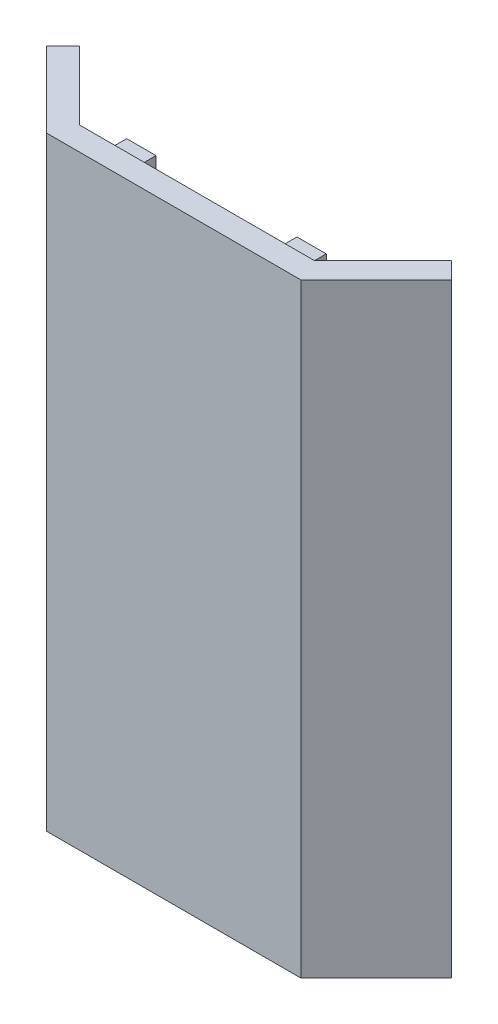
ISO-10303-21;
HEADER;
FILE_DESCRIPTION(('STEP AP214'),'2;1');
FILE_NAME('part.step','',(''),(''),'','','');
FILE_SCHEMA(('AUTOMOTIVE_DESIGN { 1 0 10303 214 1 1 1 1 }'));
ENDSEC;
DATA;
#1=APPLICATION_CONTEXT('core data for automotive mechanical design processes');
#2=APPLICATION_PROTOCOL_DEFINITION('international standard','automotive_design',2000,#1);
#3=PRODUCT_CONTEXT('',#1,'mechanical');
#4=PRODUCT('Part','Part','',(#3));
#5=PRODUCT_RELATED_PRODUCT_CATEGORY('part','',(#4));
#6=PRODUCT_DEFINITION_FORMATION('','',#4);
#7=PRODUCT_DEFINITION_CONTEXT('part definition',#1,'design');
#8=PRODUCT_DEFINITION('design','',#6,#7);
#9=PRODUCT_DEFINITION_SHAPE('','',#8);
#10=(LENGTH_UNIT() NAMED_UNIT(*) SI_UNIT(.MILLI.,.METRE.));
#11=(NAMED_UNIT(*) PLANE_ANGLE_UNIT() SI_UNIT($,.RADIAN.));
#12=(NAMED_UNIT(*) SI_UNIT($,.STERADIAN.) SOLID_ANGLE_UNIT());
#13=UNCERTAINTY_MEASURE_WITH_UNIT(LENGTH_MEASURE(1.E-05),#10,'distance_accuracy_value','');
#14=(GEOMETRIC_REPRESENTATION_CONTEXT(3) GLOBAL_UNCERTAINTY_ASSIGNED_CONTEXT((#13)) GLOBAL_UNIT_ASSIGNED_CONTEXT((#10,
#11,#12)) REPRESENTATION_CONTEXT('',''));
#15=CARTESIAN_POINT('',(0.,0.,0.));
#16=DIRECTION('',(0.,0.,1.));
#17=DIRECTION('',(1.,0.,0.));
#18=AXIS2_PLACEMENT_3D('',#15,#16,#17);
#19=CARTESIAN_POINT('',(-40.,103.,0.));
#20=DIRECTION('',(0.,0.,-1.));
#21=DIRECTION('',(-1.,0.,0.));
#22=AXIS2_PLACEMENT_3D('',#19,#20,#21);
#23=PLANE('',#22);
#24=DIRECTION('',(-1.,0.,0.));
#25=VECTOR('',#24,1.);
#26=CARTESIAN_POINT('',(-34.,97.,0.));
#27=LINE('',#26,#25);
#28=CARTESIAN_POINT('',(-24.,97.,0.));
#29=VERTEX_POINT('',#28);
#30=CARTESIAN_POINT('',(-34.,97.,0.));
#31=VERTEX_POINT('',#30);
#32=EDGE_CURVE('E204',#29,#31,#27,.T.);
#33=ORIENTED_EDGE('',*,*,#32,.T.);
#34=DIRECTION('',(0.,-1.,0.));
#35=VECTOR('',#34,1.);
#36=CARTESIAN_POINT('',(-34.,97.,0.));
#37=LINE('',#36,#35);
#38=CARTESIAN_POINT('',(-34.,91.,0.));
#39=VERTEX_POINT('',#38);
#40=EDGE_CURVE('E218',#31,#39,#37,.T.);
#41=ORIENTED_EDGE('',*,*,#40,.T.);
#42=DIRECTION('',(1.,0.,0.));
#43=VECTOR('',#42,1.);
#44=CARTESIAN_POINT('',(-34.,91.,0.));
#45=LINE('',#44,#43);
#46=CARTESIAN_POINT('',(-24.,91.,0.));
#47=VERTEX_POINT('',#46);
#48=EDGE_CURVE('E59',#39,#47,#45,.T.);
#49=ORIENTED_EDGE('',*,*,#48,.T.);
#50=DIRECTION('',(0.,1.,0.));
#51=VECTOR('',#50,1.);
#52=CARTESIAN_POINT('',(-24.,97.,0.));
#53=LINE('',#52,#51);
#54=EDGE_CURVE('E54',#47,#29,#53,.T.);
#55=ORIENTED_EDGE('',*,*,#54,.T.);
#56=EDGE_LOOP('',(#33,#41,#49,#55));
#57=FACE_BOUND('',#56,.T.);
#58=DIRECTION('',(0.,1.,0.));
#59=VECTOR('',#58,1.);
#60=CARTESIAN_POINT('',(34.,97.,0.));
#61=LINE('',#60,#59);
#62=CARTESIAN_POINT('',(34.,91.,0.));
#63=VERTEX_POINT('',#62);
#64=CARTESIAN_POINT('',(34.,97.,0.));
#65=VERTEX_POINT('',#64);
#66=EDGE_CURVE('E207',#63,#65,#61,.T.);
#67=ORIENTED_EDGE('',*,*,#66,.T.);
#68=DIRECTION('',(-1.,0.,0.));
#69=VECTOR('',#68,1.);
#70=CARTESIAN_POINT('',(34.,97.,0.));
#71=LINE('',#70,#69);
#72=CARTESIAN_POINT('',(24.,97.,0.));
#73=VERTEX_POINT('',#72);
#74=EDGE_CURVE('E240',#65,#73,#71,.T.);
#75=ORIENTED_EDGE('',*,*,#74,.T.);
#76=DIRECTION('',(0.,-1.,0.));
#77=VECTOR('',#76,1.);
#78=CARTESIAN_POINT('',(24.,97.,0.));
#79=LINE('',#78,#77);
#80=CARTESIAN_POINT('',(24.,91.,0.));
#81=VERTEX_POINT('',#80);
#82=EDGE_CURVE('E253',#73,#81,#79,.T.);
#83=ORIENTED_EDGE('',*,*,#82,.T.);
#84=DIRECTION('',(1.,0.,0.));
#85=VECTOR('',#84,1.);
#86=CARTESIAN_POINT('',(34.,91.,0.));
#87=LINE('',#86,#85);
#88=EDGE_CURVE('E251',#81,#63,#87,.T.);
#89=ORIENTED_EDGE('',*,*,#88,.T.);
#90=EDGE_LOOP('',(#67,#75,#83,#89));
#91=FACE_BOUND('',#90,.T.);
#92=DIRECTION('',(1.,0.,0.));
#93=VECTOR('',#92,1.);
#94=CARTESIAN_POINT('',(-40.,-103.,0.));
#95=LINE('',#94,#93);
#96=CARTESIAN_POINT('',(-40.,-103.,0.));
#97=VERTEX_POINT('',#96);
#98=CARTESIAN_POINT('',(40.,-103.,0.));
#99=VERTEX_POINT('',#98);
#100=EDGE_CURVE('E356',#97,#99,#95,.T.);
#101=ORIENTED_EDGE('',*,*,#100,.F.);
#102=DIRECTION('',(0.,-1.,0.));
#103=VECTOR('',#102,1.);
#104=CARTESIAN_POINT('',(-40.,103.,0.));
#105=LINE('',#104,#103);
#106=CARTESIAN_POINT('',(-40.,103.,0.));
#107=VERTEX_POINT('',#106);
#108=EDGE_CURVE('E377',#107,#97,#105,.T.);
#109=ORIENTED_EDGE('',*,*,#108,.F.);
#110=DIRECTION('',(1.,0.,0.));
#111=VECTOR('',#110,1.);
#112=CARTESIAN_POINT('',(-40.,103.,0.));
#113=LINE('',#112,#111);
#114=CARTESIAN_POINT('',(40.,103.,0.));
#115=VERTEX_POINT('',#114);
#116=EDGE_CURVE('E335',#107,#115,#113,.T.);
#117=ORIENTED_EDGE('',*,*,#116,.T.);
#118=DIRECTION('',(0.,-1.,0.));
#119=VECTOR('',#118,1.);
#120=CARTESIAN_POINT('',(40.,103.,0.));
#121=LINE('',#120,#119);
#122=EDGE_CURVE('E375',#115,#99,#121,.T.);
#123=ORIENTED_EDGE('',*,*,#122,.T.);
#124=EDGE_LOOP('',(#101,#109,#117,#123));
#125=FACE_BOUND('',#124,.T.);
#126=DIRECTION('',(-1.,0.,0.));
#127=VECTOR('',#126,1.);
#128=CARTESIAN_POINT('',(34.,-97.,0.));
#129=LINE('',#128,#127);
#130=CARTESIAN_POINT('',(34.,-97.,0.));
#131=VERTEX_POINT('',#130);
#132=CARTESIAN_POINT('',(24.,-97.,0.));
#133=VERTEX_POINT('',#132);
#134=EDGE_CURVE('E310',#131,#133,#129,.T.);
#135=ORIENTED_EDGE('',*,*,#134,.F.);
#136=DIRECTION('',(0.,-1.,0.));
#137=VECTOR('',#136,1.);
#138=CARTESIAN_POINT('',(34.,-97.,0.));
#139=LINE('',#138,#137);
#140=CARTESIAN_POINT('',(34.,-91.,0.));
#141=VERTEX_POINT('',#140);
#142=EDGE_CURVE('E296',#141,#131,#139,.T.);
#143=ORIENTED_EDGE('',*,*,#142,.F.);
#144=DIRECTION('',(1.,0.,0.));
#145=VECTOR('',#144,1.);
#146=CARTESIAN_POINT('',(34.,-91.,0.));
#147=LINE('',#146,#145);
#148=CARTESIAN_POINT('',(24.,-91.,0.));
#149=VERTEX_POINT('',#148);
#150=EDGE_CURVE('E301',#149,#141,#147,.T.);
#151=ORIENTED_EDGE('',*,*,#150,.F.);
#152=DIRECTION('',(0.,1.,0.));
#153=VECTOR('',#152,1.);
#154=CARTESIAN_POINT('',(24.,-97.,0.));
#155=LINE('',#154,#153);
#156=EDGE_CURVE('E312',#133,#149,#155,.T.);
#157=ORIENTED_EDGE('',*,*,#156,.F.);
#158=EDGE_LOOP('',(#135,#143,#151,#157));
#159=FACE_BOUND('',#158,.T.);
#160=DIRECTION('',(0.,1.,0.));
#161=VECTOR('',#160,1.);
#162=CARTESIAN_POINT('',(-34.,-97.,0.));
#163=LINE('',#162,#161);
#164=CARTESIAN_POINT('',(-34.,-97.,0.));
#165=VERTEX_POINT('',#164);
#166=CARTESIAN_POINT('',(-34.,-91.,0.));
#167=VERTEX_POINT('',#166);
#168=EDGE_CURVE('E281',#165,#167,#163,.T.);
#169=ORIENTED_EDGE('',*,*,#168,.F.);
#170=DIRECTION('',(-1.,0.,0.));
#171=VECTOR('',#170,1.);
#172=CARTESIAN_POINT('',(-34.,-97.,0.));
#173=LINE('',#172,#171);
#174=CARTESIAN_POINT('',(-24.,-97.,0.));
#175=VERTEX_POINT('',#174);
#176=EDGE_CURVE('E267',#175,#165,#173,.T.);
#177=ORIENTED_EDGE('',*,*,#176,.F.);
#178=DIRECTION('',(0.,-1.,0.));
#179=VECTOR('',#178,1.);
#180=CARTESIAN_POINT('',(-24.,-97.,0.));
#181=LINE('',#180,#179);
#182=CARTESIAN_POINT('',(-24.,-91.,0.));
#183=VERTEX_POINT('',#182);
#184=EDGE_CURVE('E272',#183,#175,#181,.T.);
#185=ORIENTED_EDGE('',*,*,#184,.F.);
#186=DIRECTION('',(1.,0.,0.));
#187=VECTOR('',#186,1.);
#188=CARTESIAN_POINT('',(-34.,-91.,0.));
#189=LINE('',#188,#187);
#190=EDGE_CURVE('E283',#167,#183,#189,.T.);
#191=ORIENTED_EDGE('',*,*,#190,.F.);
#192=EDGE_LOOP('',(#169,#177,#185,#191));
#193=FACE_BOUND('',#192,.T.);
#194=ADVANCED_FACE('F37',(#57,#91,#125,#159,#193),#23,.T.);
#195=CARTESIAN_POINT('',(-43.3137084989847,103.,8.));
#196=DIRECTION('',(-0.707106781186544,0.,0.707106781186551));
#197=DIRECTION('',(0.707106781186551,0.,0.707106781186544));
#198=AXIS2_PLACEMENT_3D('',#195,#196,#197);
#199=PLANE('',#198);
#200=DIRECTION('',(-0.707106781186551,0.,-0.707106781186544));
#201=VECTOR('',#200,1.);
#202=CARTESIAN_POINT('',(-43.3137084989847,-103.,8.));
#203=LINE('',#202,#201);
#204=CARTESIAN_POINT('',(-43.3137084989847,-103.,8.));
#205=VERTEX_POINT('',#204);
#206=CARTESIAN_POINT('',(-68.9913780286486,-103.,-17.6776695296635));
#207=VERTEX_POINT('',#206);
#208=EDGE_CURVE('E325',#205,#207,#203,.T.);
#209=ORIENTED_EDGE('',*,*,#208,.F.);
#210=DIRECTION('',(0.,-1.,0.));
#211=VECTOR('',#210,1.);
#212=CARTESIAN_POINT('',(-43.3137084989847,103.,8.));
#213=LINE('',#212,#211);
#214=CARTESIAN_POINT('',(-43.3137084989847,103.,8.));
#215=VERTEX_POINT('',#214);
#216=EDGE_CURVE('E11',#215,#205,#213,.T.);
#217=ORIENTED_EDGE('',*,*,#216,.F.);
#218=DIRECTION('',(-0.707106781186551,0.,-0.707106781186544));
#219=VECTOR('',#218,1.);
#220=CARTESIAN_POINT('',(-43.3137084989847,103.,8.));
#221=LINE('',#220,#219);
#222=CARTESIAN_POINT('',(-68.9913780286486,103.,-17.6776695296635));
#223=VERTEX_POINT('',#222);
#224=EDGE_CURVE('E326',#215,#223,#221,.T.);
#225=ORIENTED_EDGE('',*,*,#224,.T.);
#226=DIRECTION('',(0.,-1.,0.));
#227=VECTOR('',#226,1.);
#228=CARTESIAN_POINT('',(-68.9913780286486,103.,-17.6776695296635));
#229=LINE('',#228,#227);
#230=EDGE_CURVE('E41',#223,#207,#229,.T.);
#231=ORIENTED_EDGE('',*,*,#230,.T.);
#232=EDGE_LOOP('',(#209,#217,#225,#231));
#233=FACE_BOUND('',#232,.T.);
#234=ADVANCED_FACE('F39',(#233),#199,.T.);
#235=CARTESIAN_POINT('',(-43.3137084989847,103.,8.));
#236=DIRECTION('',(0.,0.,-1.));
#237=DIRECTION('',(-1.,0.,0.));
#238=AXIS2_PLACEMENT_3D('',#235,#236,#237);
#239=PLANE('',#238);
#240=DIRECTION('',(1.,0.,0.));
#241=VECTOR('',#240,1.);
#242=CARTESIAN_POINT('',(-43.3137084989847,-103.,8.));
#243=LINE('',#242,#241);
#244=CARTESIAN_POINT('',(43.3137084989848,-103.,8.));
#245=VERTEX_POINT('',#244);
#246=EDGE_CURVE('E330',#205,#245,#243,.T.);
#247=ORIENTED_EDGE('',*,*,#246,.T.);
#248=DIRECTION('',(0.,-1.,0.));
#249=VECTOR('',#248,1.);
#250=CARTESIAN_POINT('',(43.3137084989848,103.,8.));
#251=LINE('',#250,#249);
#252=CARTESIAN_POINT('',(43.3137084989848,103.,8.));
#253=VERTEX_POINT('',#252);
#254=EDGE_CURVE('E46',#253,#245,#251,.T.);
#255=ORIENTED_EDGE('',*,*,#254,.F.);
#256=DIRECTION('',(1.,0.,0.));
#257=VECTOR('',#256,1.);
#258=CARTESIAN_POINT('',(-43.3137084989847,103.,8.));
#259=LINE('',#258,#257);
#260=EDGE_CURVE('E346',#215,#253,#259,.T.);
#261=ORIENTED_EDGE('',*,*,#260,.F.);
#262=ORIENTED_EDGE('',*,*,#216,.T.);
#263=EDGE_LOOP('',(#247,#255,#261,#262));
#264=FACE_BOUND('',#263,.T.);
#265=ADVANCED_FACE('F394',(#264),#239,.F.);
#266=CARTESIAN_POINT('',(43.3137084989848,103.,8.));
#267=DIRECTION('',(-0.707106781186548,0.,-0.707106781186548));
#268=DIRECTION('',(-0.707106781186548,0.,0.707106781186548));
#269=AXIS2_PLACEMENT_3D('',#266,#267,#268);
#270=PLANE('',#269);
#271=DIRECTION('',(0.707106781186548,0.,-0.707106781186548));
#272=VECTOR('',#271,1.);
#273=CARTESIAN_POINT('',(43.3137084989848,-103.,8.));
#274=LINE('',#273,#272);
#275=CARTESIAN_POINT('',(68.9913780286485,-103.,-17.6776695296637));
#276=VERTEX_POINT('',#275);
#277=EDGE_CURVE('E365',#245,#276,#274,.T.);
#278=ORIENTED_EDGE('',*,*,#277,.T.);
#279=DIRECTION('',(0.,-1.,0.));
#280=VECTOR('',#279,1.);
#281=CARTESIAN_POINT('',(68.9913780286485,103.,-17.6776695296637));
#282=LINE('',#281,#280);
#283=CARTESIAN_POINT('',(68.9913780286485,103.,-17.6776695296637));
#284=VERTEX_POINT('',#283);
#285=EDGE_CURVE('E371',#284,#276,#282,.T.);
#286=ORIENTED_EDGE('',*,*,#285,.F.);
#287=DIRECTION('',(0.707106781186548,0.,-0.707106781186548));
#288=VECTOR('',#287,1.);
#289=CARTESIAN_POINT('',(43.3137084989848,103.,8.));
#290=LINE('',#289,#288);
#291=EDGE_CURVE('E344',#253,#284,#290,.T.);
#292=ORIENTED_EDGE('',*,*,#291,.F.);
#293=ORIENTED_EDGE('',*,*,#254,.T.);
#294=EDGE_LOOP('',(#278,#286,#292,#293));
#295=FACE_BOUND('',#294,.T.);
#296=ADVANCED_FACE('F398',(#295),#270,.F.);
#297=CARTESIAN_POINT('',(63.3345237791561,103.,-23.3345237791561));
#298=DIRECTION('',(0.707106781186546,0.,-0.707106781186549));
#299=DIRECTION('',(-0.707106781186549,0.,-0.707106781186546));
#300=AXIS2_PLACEMENT_3D('',#297,#298,#299);
#301=PLANE('',#300);
#302=DIRECTION('',(0.707106781186549,0.,0.707106781186546));
#303=VECTOR('',#302,1.);
#304=CARTESIAN_POINT('',(63.3345237791561,-103.,-23.3345237791561));
#305=LINE('',#304,#303);
#306=CARTESIAN_POINT('',(63.3345237791561,-103.,-23.3345237791561));
#307=VERTEX_POINT('',#306);
#308=EDGE_CURVE('E362',#307,#276,#305,.T.);
#309=ORIENTED_EDGE('',*,*,#308,.F.);
#310=DIRECTION('',(0.,-1.,0.));
#311=VECTOR('',#310,1.);
#312=CARTESIAN_POINT('',(63.3345237791561,103.,-23.3345237791561));
#313=LINE('',#312,#311);
#314=CARTESIAN_POINT('',(63.3345237791561,103.,-23.3345237791561));
#315=VERTEX_POINT('',#314);
#316=EDGE_CURVE('E373',#315,#307,#313,.T.);
#317=ORIENTED_EDGE('',*,*,#316,.F.);
#318=DIRECTION('',(0.707106781186549,0.,0.707106781186546));
#319=VECTOR('',#318,1.);
#320=CARTESIAN_POINT('',(63.3345237791561,103.,-23.3345237791561));
#321=LINE('',#320,#319);
#322=EDGE_CURVE('E341',#315,#284,#321,.T.);
#323=ORIENTED_EDGE('',*,*,#322,.T.);
#324=ORIENTED_EDGE('',*,*,#285,.T.);
#325=EDGE_LOOP('',(#309,#317,#323,#324));
#326=FACE_BOUND('',#325,.T.);
#327=ADVANCED_FACE('F416',(#326),#301,.T.);
#328=CARTESIAN_POINT('',(40.,103.,0.));
#329=DIRECTION('',(-0.707106781186547,0.,-0.707106781186548));
#330=DIRECTION('',(-0.707106781186548,0.,0.707106781186547));
#331=AXIS2_PLACEMENT_3D('',#328,#329,#330);
#332=PLANE('',#331);
#333=DIRECTION('',(0.707106781186548,0.,-0.707106781186547));
#334=VECTOR('',#333,1.);
#335=CARTESIAN_POINT('',(40.,-103.,0.));
#336=LINE('',#335,#334);
#337=EDGE_CURVE('E359',#99,#307,#336,.T.);
#338=ORIENTED_EDGE('',*,*,#337,.F.);
#339=ORIENTED_EDGE('',*,*,#122,.F.);
#340=DIRECTION('',(0.707106781186548,0.,-0.707106781186547));
#341=VECTOR('',#340,1.);
#342=CARTESIAN_POINT('',(40.,103.,0.));
#343=LINE('',#342,#341);
#344=EDGE_CURVE('E338',#115,#315,#343,.T.);
#345=ORIENTED_EDGE('',*,*,#344,.T.);
#346=ORIENTED_EDGE('',*,*,#316,.T.);
#347=EDGE_LOOP('',(#338,#339,#345,#346));
#348=FACE_BOUND('',#347,.T.);
#349=ADVANCED_FACE('F413',(#348),#332,.T.);
#350=CARTESIAN_POINT('',(-40.,103.,0.));
#351=DIRECTION('',(-0.707106781186544,0.,0.707106781186551));
#352=DIRECTION('',(0.707106781186551,0.,0.707106781186544));
#353=AXIS2_PLACEMENT_3D('',#350,#351,#352);
#354=PLANE('',#353);
#355=DIRECTION('',(-0.707106781186551,0.,-0.707106781186544));
#356=VECTOR('',#355,1.);
#357=CARTESIAN_POINT('',(-40.,-103.,0.));
#358=LINE('',#357,#356);
#359=CARTESIAN_POINT('',(-63.3345237791562,-103.,-23.3345237791559));
#360=VERTEX_POINT('',#359);
#361=EDGE_CURVE('E353',#97,#360,#358,.T.);
#362=ORIENTED_EDGE('',*,*,#361,.T.);
#363=DIRECTION('',(0.,-1.,0.));
#364=VECTOR('',#363,1.);
#365=CARTESIAN_POINT('',(-63.3345237791562,103.,-23.3345237791559));
#366=LINE('',#365,#364);
#367=CARTESIAN_POINT('',(-63.3345237791562,103.,-23.3345237791559));
#368=VERTEX_POINT('',#367);
#369=EDGE_CURVE('E378',#368,#360,#366,.T.);
#370=ORIENTED_EDGE('',*,*,#369,.F.);
#371=DIRECTION('',(-0.707106781186551,0.,-0.707106781186544));
#372=VECTOR('',#371,1.);
#373=CARTESIAN_POINT('',(-40.,103.,0.));
#374=LINE('',#373,#372);
#375=EDGE_CURVE('E333',#107,#368,#374,.T.);
#376=ORIENTED_EDGE('',*,*,#375,.F.);
#377=ORIENTED_EDGE('',*,*,#108,.T.);
#378=EDGE_LOOP('',(#362,#370,#376,#377));
#379=FACE_BOUND('',#378,.T.);
#380=ADVANCED_FACE('F407',(#379),#354,.F.);
#381=CARTESIAN_POINT('',(-68.9913780286486,103.,-17.6776695296635));
#382=DIRECTION('',(-0.707106781186551,0.,-0.707106781186543));
#383=DIRECTION('',(-0.707106781186544,0.,0.707106781186552));
#384=AXIS2_PLACEMENT_3D('',#381,#382,#383);
#385=PLANE('',#384);
#386=DIRECTION('',(0.707106781186544,0.,-0.707106781186551));
#387=VECTOR('',#386,1.);
#388=CARTESIAN_POINT('',(-68.9913780286486,-103.,-17.6776695296635));
#389=LINE('',#388,#387);
#390=EDGE_CURVE('E350',#207,#360,#389,.T.);
#391=ORIENTED_EDGE('',*,*,#390,.F.);
#392=ORIENTED_EDGE('',*,*,#230,.F.);
#393=DIRECTION('',(0.707106781186544,0.,-0.707106781186551));
#394=VECTOR('',#393,1.);
#395=CARTESIAN_POINT('',(-68.9913780286486,103.,-17.6776695296635));
#396=LINE('',#395,#394);
#397=EDGE_CURVE('E329',#223,#368,#396,.T.);
#398=ORIENTED_EDGE('',*,*,#397,.T.);
#399=ORIENTED_EDGE('',*,*,#369,.T.);
#400=EDGE_LOOP('',(#391,#392,#398,#399));
#401=FACE_BOUND('',#400,.T.);
#402=ADVANCED_FACE('F386',(#401),#385,.T.);
#403=CARTESIAN_POINT('',(0.,103.,0.));
#404=DIRECTION('',(0.,-1.,0.));
#405=DIRECTION('',(0.,0.,-1.));
#406=AXIS2_PLACEMENT_3D('',#403,#404,#405);
#407=PLANE('',#406);
#408=ORIENTED_EDGE('',*,*,#224,.F.);
#409=ORIENTED_EDGE('',*,*,#260,.T.);
#410=ORIENTED_EDGE('',*,*,#291,.T.);
#411=ORIENTED_EDGE('',*,*,#322,.F.);
#412=ORIENTED_EDGE('',*,*,#344,.F.);
#413=ORIENTED_EDGE('',*,*,#116,.F.);
#414=ORIENTED_EDGE('',*,*,#375,.T.);
#415=ORIENTED_EDGE('',*,*,#397,.F.);
#416=EDGE_LOOP('',(#408,#409,#410,#411,#412,#413,#414,#415));
#417=FACE_BOUND('',#416,.T.);
#418=ADVANCED_FACE('F402',(#417),#407,.F.);
#419=CARTESIAN_POINT('',(0.,-103.,0.));
#420=DIRECTION('',(0.,-1.,0.));
#421=DIRECTION('',(0.,0.,-1.));
#422=AXIS2_PLACEMENT_3D('',#419,#420,#421);
#423=PLANE('',#422);
#424=ORIENTED_EDGE('',*,*,#208,.T.);
#425=ORIENTED_EDGE('',*,*,#390,.T.);
#426=ORIENTED_EDGE('',*,*,#361,.F.);
#427=ORIENTED_EDGE('',*,*,#100,.T.);
#428=ORIENTED_EDGE('',*,*,#337,.T.);
#429=ORIENTED_EDGE('',*,*,#308,.T.);
#430=ORIENTED_EDGE('',*,*,#277,.F.);
#431=ORIENTED_EDGE('',*,*,#246,.F.);
#432=EDGE_LOOP('',(#424,#425,#426,#427,#428,#429,#430,#431));
#433=FACE_BOUND('',#432,.T.);
#434=ADVANCED_FACE('F390',(#433),#423,.T.);
#435=CARTESIAN_POINT('',(34.,-97.,-10.));
#436=DIRECTION('',(-1.,0.,0.));
#437=DIRECTION('',(0.,0.,1.));
#438=AXIS2_PLACEMENT_3D('',#435,#436,#437);
#439=PLANE('',#438);
#440=ORIENTED_EDGE('',*,*,#142,.T.);
#441=DIRECTION('',(0.,0.,1.));
#442=VECTOR('',#441,1.);
#443=CARTESIAN_POINT('',(34.,-97.,-10.));
#444=LINE('',#443,#442);
#445=CARTESIAN_POINT('',(34.,-97.,-10.));
#446=VERTEX_POINT('',#445);
#447=EDGE_CURVE('E323',#446,#131,#444,.T.);
#448=ORIENTED_EDGE('',*,*,#447,.F.);
#449=DIRECTION('',(0.,-1.,0.));
#450=VECTOR('',#449,1.);
#451=CARTESIAN_POINT('',(34.,-97.,-10.));
#452=LINE('',#451,#450);
#453=CARTESIAN_POINT('',(34.,-91.,-10.));
#454=VERTEX_POINT('',#453);
#455=EDGE_CURVE('E297',#454,#446,#452,.T.);
#456=ORIENTED_EDGE('',*,*,#455,.F.);
#457=DIRECTION('',(0.,0.,1.));
#458=VECTOR('',#457,1.);
#459=CARTESIAN_POINT('',(34.,-91.,-10.));
#460=LINE('',#459,#458);
#461=EDGE_CURVE('E307',#454,#141,#460,.T.);
#462=ORIENTED_EDGE('',*,*,#461,.T.);
#463=EDGE_LOOP('',(#440,#448,#456,#462));
#464=FACE_BOUND('',#463,.T.);
#465=ADVANCED_FACE('F441',(#464),#439,.F.);
#466=CARTESIAN_POINT('',(34.,-97.,-10.));
#467=DIRECTION('',(0.,1.,0.));
#468=DIRECTION('',(0.,0.,1.));
#469=AXIS2_PLACEMENT_3D('',#466,#467,#468);
#470=PLANE('',#469);
#471=ORIENTED_EDGE('',*,*,#134,.T.);
#472=DIRECTION('',(0.,0.,1.));
#473=VECTOR('',#472,1.);
#474=CARTESIAN_POINT('',(24.,-97.,-10.));
#475=LINE('',#474,#473);
#476=CARTESIAN_POINT('',(24.,-97.,-10.));
#477=VERTEX_POINT('',#476);
#478=EDGE_CURVE('E320',#477,#133,#475,.T.);
#479=ORIENTED_EDGE('',*,*,#478,.F.);
#480=DIRECTION('',(-1.,0.,0.));
#481=VECTOR('',#480,1.);
#482=CARTESIAN_POINT('',(34.,-97.,-10.));
#483=LINE('',#482,#481);
#484=EDGE_CURVE('E300',#446,#477,#483,.T.);
#485=ORIENTED_EDGE('',*,*,#484,.F.);
#486=ORIENTED_EDGE('',*,*,#447,.T.);
#487=EDGE_LOOP('',(#471,#479,#485,#486));
#488=FACE_BOUND('',#487,.T.);
#489=ADVANCED_FACE('F502',(#488),#470,.F.);
#490=CARTESIAN_POINT('',(24.,-97.,-10.));
#491=DIRECTION('',(1.,0.,0.));
#492=DIRECTION('',(0.,0.,-1.));
#493=AXIS2_PLACEMENT_3D('',#490,#491,#492);
#494=PLANE('',#493);
#495=ORIENTED_EDGE('',*,*,#156,.T.);
#496=DIRECTION('',(0.,0.,1.));
#497=VECTOR('',#496,1.);
#498=CARTESIAN_POINT('',(24.,-91.,-10.));
#499=LINE('',#498,#497);
#500=CARTESIAN_POINT('',(24.,-91.,-10.));
#501=VERTEX_POINT('',#500);
#502=EDGE_CURVE('E318',#501,#149,#499,.T.);
#503=ORIENTED_EDGE('',*,*,#502,.F.);
#504=DIRECTION('',(0.,1.,0.));
#505=VECTOR('',#504,1.);
#506=CARTESIAN_POINT('',(24.,-97.,-10.));
#507=LINE('',#506,#505);
#508=EDGE_CURVE('E303',#477,#501,#507,.T.);
#509=ORIENTED_EDGE('',*,*,#508,.F.);
#510=ORIENTED_EDGE('',*,*,#478,.T.);
#511=EDGE_LOOP('',(#495,#503,#509,#510));
#512=FACE_BOUND('',#511,.T.);
#513=ADVANCED_FACE('F512',(#512),#494,.F.);
#514=CARTESIAN_POINT('',(34.,-91.,-10.));
#515=DIRECTION('',(0.,-1.,0.));
#516=DIRECTION('',(0.,0.,-1.));
#517=AXIS2_PLACEMENT_3D('',#514,#515,#516);
#518=PLANE('',#517);
#519=ORIENTED_EDGE('',*,*,#150,.T.);
#520=ORIENTED_EDGE('',*,*,#461,.F.);
#521=DIRECTION('',(1.,0.,0.));
#522=VECTOR('',#521,1.);
#523=CARTESIAN_POINT('',(34.,-91.,-10.));
#524=LINE('',#523,#522);
#525=EDGE_CURVE('E305',#501,#454,#524,.T.);
#526=ORIENTED_EDGE('',*,*,#525,.F.);
#527=ORIENTED_EDGE('',*,*,#502,.T.);
#528=EDGE_LOOP('',(#519,#520,#526,#527));
#529=FACE_BOUND('',#528,.T.);
#530=ADVANCED_FACE('F522',(#529),#518,.F.);
#531=CARTESIAN_POINT('',(0.,0.,-10.));
#532=DIRECTION('',(0.,0.,1.));
#533=DIRECTION('',(1.,0.,0.));
#534=AXIS2_PLACEMENT_3D('',#531,#532,#533);
#535=PLANE('',#534);
#536=ORIENTED_EDGE('',*,*,#455,.T.);
#537=ORIENTED_EDGE('',*,*,#484,.T.);
#538=ORIENTED_EDGE('',*,*,#508,.T.);
#539=ORIENTED_EDGE('',*,*,#525,.T.);
#540=EDGE_LOOP('',(#536,#537,#538,#539));
#541=FACE_BOUND('',#540,.T.);
#542=ADVANCED_FACE('F533',(#541),#535,.F.);
#543=CARTESIAN_POINT('',(-34.,-97.,-10.));
#544=DIRECTION('',(0.,1.,0.));
#545=DIRECTION('',(0.,0.,1.));
#546=AXIS2_PLACEMENT_3D('',#543,#544,#545);
#547=PLANE('',#546);
#548=ORIENTED_EDGE('',*,*,#176,.T.);
#549=DIRECTION('',(0.,0.,1.));
#550=VECTOR('',#549,1.);
#551=CARTESIAN_POINT('',(-34.,-97.,-10.));
#552=LINE('',#551,#550);
#553=CARTESIAN_POINT('',(-34.,-97.,-10.));
#554=VERTEX_POINT('',#553);
#555=EDGE_CURVE('E294',#554,#165,#552,.T.);
#556=ORIENTED_EDGE('',*,*,#555,.F.);
#557=DIRECTION('',(-1.,0.,0.));
#558=VECTOR('',#557,1.);
#559=CARTESIAN_POINT('',(-34.,-97.,-10.));
#560=LINE('',#559,#558);
#561=CARTESIAN_POINT('',(-24.,-97.,-10.));
#562=VERTEX_POINT('',#561);
#563=EDGE_CURVE('E268',#562,#554,#560,.T.);
#564=ORIENTED_EDGE('',*,*,#563,.F.);
#565=DIRECTION('',(0.,0.,1.));
#566=VECTOR('',#565,1.);
#567=CARTESIAN_POINT('',(-24.,-97.,-10.));
#568=LINE('',#567,#566);
#569=EDGE_CURVE('E278',#562,#175,#568,.T.);
#570=ORIENTED_EDGE('',*,*,#569,.T.);
#571=EDGE_LOOP('',(#548,#556,#564,#570));
#572=FACE_BOUND('',#571,.T.);
#573=ADVANCED_FACE('F544',(#572),#547,.F.);
#574=CARTESIAN_POINT('',(-34.,-97.,-10.));
#575=DIRECTION('',(1.,0.,0.));
#576=DIRECTION('',(0.,0.,-1.));
#577=AXIS2_PLACEMENT_3D('',#574,#575,#576);
#578=PLANE('',#577);
#579=ORIENTED_EDGE('',*,*,#168,.T.);
#580=DIRECTION('',(0.,0.,1.));
#581=VECTOR('',#580,1.);
#582=CARTESIAN_POINT('',(-34.,-91.,-10.));
#583=LINE('',#582,#581);
#584=CARTESIAN_POINT('',(-34.,-91.,-10.));
#585=VERTEX_POINT('',#584);
#586=EDGE_CURVE('E291',#585,#167,#583,.T.);
#587=ORIENTED_EDGE('',*,*,#586,.F.);
#588=DIRECTION('',(0.,1.,0.));
#589=VECTOR('',#588,1.);
#590=CARTESIAN_POINT('',(-34.,-97.,-10.));
#591=LINE('',#590,#589);
#592=EDGE_CURVE('E271',#554,#585,#591,.T.);
#593=ORIENTED_EDGE('',*,*,#592,.F.);
#594=ORIENTED_EDGE('',*,*,#555,.T.);
#595=EDGE_LOOP('',(#579,#587,#593,#594));
#596=FACE_BOUND('',#595,.T.);
#597=ADVANCED_FACE('F555',(#596),#578,.F.);
#598=CARTESIAN_POINT('',(-34.,-91.,-10.));
#599=DIRECTION('',(0.,-1.,0.));
#600=DIRECTION('',(0.,0.,-1.));
#601=AXIS2_PLACEMENT_3D('',#598,#599,#600);
#602=PLANE('',#601);
#603=ORIENTED_EDGE('',*,*,#190,.T.);
#604=DIRECTION('',(0.,0.,1.));
#605=VECTOR('',#604,1.);
#606=CARTESIAN_POINT('',(-24.,-91.,-10.));
#607=LINE('',#606,#605);
#608=CARTESIAN_POINT('',(-24.,-91.,-10.));
#609=VERTEX_POINT('',#608);
#610=EDGE_CURVE('E289',#609,#183,#607,.T.);
#611=ORIENTED_EDGE('',*,*,#610,.F.);
#612=DIRECTION('',(1.,0.,0.));
#613=VECTOR('',#612,1.);
#614=CARTESIAN_POINT('',(-34.,-91.,-10.));
#615=LINE('',#614,#613);
#616=EDGE_CURVE('E274',#585,#609,#615,.T.);
#617=ORIENTED_EDGE('',*,*,#616,.F.);
#618=ORIENTED_EDGE('',*,*,#586,.T.);
#619=EDGE_LOOP('',(#603,#611,#617,#618));
#620=FACE_BOUND('',#619,.T.);
#621=ADVANCED_FACE('F566',(#620),#602,.F.);
#622=CARTESIAN_POINT('',(-24.,-97.,-10.));
#623=DIRECTION('',(-1.,0.,0.));
#624=DIRECTION('',(0.,0.,1.));
#625=AXIS2_PLACEMENT_3D('',#622,#623,#624);
#626=PLANE('',#625);
#627=ORIENTED_EDGE('',*,*,#184,.T.);
#628=ORIENTED_EDGE('',*,*,#569,.F.);
#629=DIRECTION('',(0.,-1.,0.));
#630=VECTOR('',#629,1.);
#631=CARTESIAN_POINT('',(-24.,-97.,-10.));
#632=LINE('',#631,#630);
#633=EDGE_CURVE('E276',#609,#562,#632,.T.);
#634=ORIENTED_EDGE('',*,*,#633,.F.);
#635=ORIENTED_EDGE('',*,*,#610,.T.);
#636=EDGE_LOOP('',(#627,#628,#634,#635));
#637=FACE_BOUND('',#636,.T.);
#638=ADVANCED_FACE('F577',(#637),#626,.F.);
#639=CARTESIAN_POINT('',(0.,0.,-10.));
#640=DIRECTION('',(0.,0.,1.));
#641=DIRECTION('',(1.,0.,0.));
#642=AXIS2_PLACEMENT_3D('',#639,#640,#641);
#643=PLANE('',#642);
#644=ORIENTED_EDGE('',*,*,#563,.T.);
#645=ORIENTED_EDGE('',*,*,#592,.T.);
#646=ORIENTED_EDGE('',*,*,#616,.T.);
#647=ORIENTED_EDGE('',*,*,#633,.T.);
#648=EDGE_LOOP('',(#644,#645,#646,#647));
#649=FACE_BOUND('',#648,.T.);
#650=ADVANCED_FACE('F588',(#649),#643,.F.);
#651=CARTESIAN_POINT('',(34.,97.,-10.));
#652=DIRECTION('',(1.,0.,0.));
#653=DIRECTION('',(0.,0.,-1.));
#654=AXIS2_PLACEMENT_3D('',#651,#652,#653);
#655=PLANE('',#654);
#656=ORIENTED_EDGE('',*,*,#66,.F.);
#657=DIRECTION('',(0.,0.,1.));
#658=VECTOR('',#657,1.);
#659=CARTESIAN_POINT('',(34.,91.,-10.));
#660=LINE('',#659,#658);
#661=CARTESIAN_POINT('',(34.,91.,-10.));
#662=VERTEX_POINT('',#661);
#663=EDGE_CURVE('E264',#662,#63,#660,.T.);
#664=ORIENTED_EDGE('',*,*,#663,.F.);
#665=DIRECTION('',(0.,1.,0.));
#666=VECTOR('',#665,1.);
#667=CARTESIAN_POINT('',(34.,97.,-10.));
#668=LINE('',#667,#666);
#669=CARTESIAN_POINT('',(34.,97.,-10.));
#670=VERTEX_POINT('',#669);
#671=EDGE_CURVE('E236',#662,#670,#668,.T.);
#672=ORIENTED_EDGE('',*,*,#671,.T.);
#673=DIRECTION('',(0.,0.,1.));
#674=VECTOR('',#673,1.);
#675=CARTESIAN_POINT('',(34.,97.,-10.));
#676=LINE('',#675,#674);
#677=EDGE_CURVE('E249',#670,#65,#676,.T.);
#678=ORIENTED_EDGE('',*,*,#677,.T.);
#679=EDGE_LOOP('',(#656,#664,#672,#678));
#680=FACE_BOUND('',#679,.T.);
#681=ADVANCED_FACE('F598',(#680),#655,.T.);
#682=CARTESIAN_POINT('',(34.,91.,-10.));
#683=DIRECTION('',(0.,-1.,0.));
#684=DIRECTION('',(0.,0.,-1.));
#685=AXIS2_PLACEMENT_3D('',#682,#683,#684);
#686=PLANE('',#685);
#687=ORIENTED_EDGE('',*,*,#88,.F.);
#688=DIRECTION('',(0.,0.,1.));
#689=VECTOR('',#688,1.);
#690=CARTESIAN_POINT('',(24.,91.,-10.));
#691=LINE('',#690,#689);
#692=CARTESIAN_POINT('',(24.,91.,-10.));
#693=VERTEX_POINT('',#692);
#694=EDGE_CURVE('E261',#693,#81,#691,.T.);
#695=ORIENTED_EDGE('',*,*,#694,.F.);
#696=DIRECTION('',(1.,0.,0.));
#697=VECTOR('',#696,1.);
#698=CARTESIAN_POINT('',(34.,91.,-10.));
#699=LINE('',#698,#697);
#700=EDGE_CURVE('E239',#693,#662,#699,.T.);
#701=ORIENTED_EDGE('',*,*,#700,.T.);
#702=ORIENTED_EDGE('',*,*,#663,.T.);
#703=EDGE_LOOP('',(#687,#695,#701,#702));
#704=FACE_BOUND('',#703,.T.);
#705=ADVANCED_FACE('F614',(#704),#686,.T.);
#706=CARTESIAN_POINT('',(24.,97.,-10.));
#707=DIRECTION('',(-1.,0.,0.));
#708=DIRECTION('',(0.,0.,1.));
#709=AXIS2_PLACEMENT_3D('',#706,#707,#708);
#710=PLANE('',#709);
#711=ORIENTED_EDGE('',*,*,#82,.F.);
#712=DIRECTION('',(0.,0.,1.));
#713=VECTOR('',#712,1.);
#714=CARTESIAN_POINT('',(24.,97.,-10.));
#715=LINE('',#714,#713);
#716=CARTESIAN_POINT('',(24.,97.,-10.));
#717=VERTEX_POINT('',#716);
#718=EDGE_CURVE('E258',#717,#73,#715,.T.);
#719=ORIENTED_EDGE('',*,*,#718,.F.);
#720=DIRECTION('',(0.,-1.,0.));
#721=VECTOR('',#720,1.);
#722=CARTESIAN_POINT('',(24.,97.,-10.));
#723=LINE('',#722,#721);
#724=EDGE_CURVE('E243',#717,#693,#723,.T.);
#725=ORIENTED_EDGE('',*,*,#724,.T.);
#726=ORIENTED_EDGE('',*,*,#694,.T.);
#727=EDGE_LOOP('',(#711,#719,#725,#726));
#728=FACE_BOUND('',#727,.T.);
#729=ADVANCED_FACE('F625',(#728),#710,.T.);
#730=CARTESIAN_POINT('',(34.,97.,-10.));
#731=DIRECTION('',(0.,1.,0.));
#732=DIRECTION('',(0.,0.,1.));
#733=AXIS2_PLACEMENT_3D('',#730,#731,#732);
#734=PLANE('',#733);
#735=ORIENTED_EDGE('',*,*,#74,.F.);
#736=ORIENTED_EDGE('',*,*,#677,.F.);
#737=DIRECTION('',(-1.,0.,0.));
#738=VECTOR('',#737,1.);
#739=CARTESIAN_POINT('',(34.,97.,-10.));
#740=LINE('',#739,#738);
#741=EDGE_CURVE('E246',#670,#717,#740,.T.);
#742=ORIENTED_EDGE('',*,*,#741,.T.);
#743=ORIENTED_EDGE('',*,*,#718,.T.);
#744=EDGE_LOOP('',(#735,#736,#742,#743));
#745=FACE_BOUND('',#744,.T.);
#746=ADVANCED_FACE('F636',(#745),#734,.T.);
#747=CARTESIAN_POINT('',(0.,0.,-10.));
#748=DIRECTION('',(0.,0.,1.));
#749=DIRECTION('',(1.,0.,0.));
#750=AXIS2_PLACEMENT_3D('',#747,#748,#749);
#751=PLANE('',#750);
#752=ORIENTED_EDGE('',*,*,#671,.F.);
#753=ORIENTED_EDGE('',*,*,#700,.F.);
#754=ORIENTED_EDGE('',*,*,#724,.F.);
#755=ORIENTED_EDGE('',*,*,#741,.F.);
#756=EDGE_LOOP('',(#752,#753,#754,#755));
#757=FACE_BOUND('',#756,.T.);
#758=ADVANCED_FACE('F647',(#757),#751,.F.);
#759=CARTESIAN_POINT('',(-34.,97.,-10.));
#760=DIRECTION('',(0.,1.,0.));
#761=DIRECTION('',(0.,0.,1.));
#762=AXIS2_PLACEMENT_3D('',#759,#760,#761);
#763=PLANE('',#762);
#764=ORIENTED_EDGE('',*,*,#32,.F.);
#765=DIRECTION('',(0.,0.,1.));
#766=VECTOR('',#765,1.);
#767=CARTESIAN_POINT('',(-24.,97.,-10.));
#768=LINE('',#767,#766);
#769=CARTESIAN_POINT('',(-24.,97.,-10.));
#770=VERTEX_POINT('',#769);
#771=EDGE_CURVE('E198',#770,#29,#768,.T.);
#772=ORIENTED_EDGE('',*,*,#771,.F.);
#773=DIRECTION('',(-1.,0.,0.));
#774=VECTOR('',#773,1.);
#775=CARTESIAN_POINT('',(-34.,97.,-10.));
#776=LINE('',#775,#774);
#777=CARTESIAN_POINT('',(-34.,97.,-10.));
#778=VERTEX_POINT('',#777);
#779=EDGE_CURVE('E202',#770,#778,#776,.T.);
#780=ORIENTED_EDGE('',*,*,#779,.T.);
#781=DIRECTION('',(0.,0.,1.));
#782=VECTOR('',#781,1.);
#783=CARTESIAN_POINT('',(-34.,97.,-10.));
#784=LINE('',#783,#782);
#785=EDGE_CURVE('E226',#778,#31,#784,.T.);
#786=ORIENTED_EDGE('',*,*,#785,.T.);
#787=EDGE_LOOP('',(#764,#772,#780,#786));
#788=FACE_BOUND('',#787,.T.);
#789=ADVANCED_FACE('F200',(#788),#763,.T.);
#790=CARTESIAN_POINT('',(-24.,97.,-10.));
#791=DIRECTION('',(1.,0.,0.));
#792=DIRECTION('',(0.,0.,-1.));
#793=AXIS2_PLACEMENT_3D('',#790,#791,#792);
#794=PLANE('',#793);
#795=ORIENTED_EDGE('',*,*,#54,.F.);
#796=DIRECTION('',(0.,0.,1.));
#797=VECTOR('',#796,1.);
#798=CARTESIAN_POINT('',(-24.,91.,-10.));
#799=LINE('',#798,#797);
#800=CARTESIAN_POINT('',(-24.,91.,-10.));
#801=VERTEX_POINT('',#800);
#802=EDGE_CURVE('E208',#801,#47,#799,.T.);
#803=ORIENTED_EDGE('',*,*,#802,.F.);
#804=DIRECTION('',(0.,1.,0.));
#805=VECTOR('',#804,1.);
#806=CARTESIAN_POINT('',(-24.,97.,-10.));
#807=LINE('',#806,#805);
#808=EDGE_CURVE('E214',#801,#770,#807,.T.);
#809=ORIENTED_EDGE('',*,*,#808,.T.);
#810=ORIENTED_EDGE('',*,*,#771,.T.);
#811=EDGE_LOOP('',(#795,#803,#809,#810));
#812=FACE_BOUND('',#811,.T.);
#813=ADVANCED_FACE('F220',(#812),#794,.T.);
#814=CARTESIAN_POINT('',(-34.,91.,-10.));
#815=DIRECTION('',(0.,-1.,0.));
#816=DIRECTION('',(0.,0.,-1.));
#817=AXIS2_PLACEMENT_3D('',#814,#815,#816);
#818=PLANE('',#817);
#819=ORIENTED_EDGE('',*,*,#48,.F.);
#820=DIRECTION('',(0.,0.,1.));
#821=VECTOR('',#820,1.);
#822=CARTESIAN_POINT('',(-34.,91.,-10.));
#823=LINE('',#822,#821);
#824=CARTESIAN_POINT('',(-34.,91.,-10.));
#825=VERTEX_POINT('',#824);
#826=EDGE_CURVE('E232',#825,#39,#823,.T.);
#827=ORIENTED_EDGE('',*,*,#826,.F.);
#828=DIRECTION('',(1.,0.,0.));
#829=VECTOR('',#828,1.);
#830=CARTESIAN_POINT('',(-34.,91.,-10.));
#831=LINE('',#830,#829);
#832=EDGE_CURVE('E221',#825,#801,#831,.T.);
#833=ORIENTED_EDGE('',*,*,#832,.T.);
#834=ORIENTED_EDGE('',*,*,#802,.T.);
#835=EDGE_LOOP('',(#819,#827,#833,#834));
#836=FACE_BOUND('',#835,.T.);
#837=ADVANCED_FACE('F677',(#836),#818,.T.);
#838=CARTESIAN_POINT('',(-34.,97.,-10.));
#839=DIRECTION('',(-1.,0.,0.));
#840=DIRECTION('',(0.,0.,1.));
#841=AXIS2_PLACEMENT_3D('',#838,#839,#840);
#842=PLANE('',#841);
#843=ORIENTED_EDGE('',*,*,#40,.F.);
#844=ORIENTED_EDGE('',*,*,#785,.F.);
#845=DIRECTION('',(0.,-1.,0.));
#846=VECTOR('',#845,1.);
#847=CARTESIAN_POINT('',(-34.,97.,-10.));
#848=LINE('',#847,#846);
#849=EDGE_CURVE('E217',#778,#825,#848,.T.);
#850=ORIENTED_EDGE('',*,*,#849,.T.);
#851=ORIENTED_EDGE('',*,*,#826,.T.);
#852=EDGE_LOOP('',(#843,#844,#850,#851));
#853=FACE_BOUND('',#852,.T.);
#854=ADVANCED_FACE('F687',(#853),#842,.T.);
#855=CARTESIAN_POINT('',(0.,0.,-10.));
#856=DIRECTION('',(0.,0.,1.));
#857=DIRECTION('',(1.,0.,0.));
#858=AXIS2_PLACEMENT_3D('',#855,#856,#857);
#859=PLANE('',#858);
#860=ORIENTED_EDGE('',*,*,#779,.F.);
#861=ORIENTED_EDGE('',*,*,#808,.F.);
#862=ORIENTED_EDGE('',*,*,#832,.F.);
#863=ORIENTED_EDGE('',*,*,#849,.F.);
#864=EDGE_LOOP('',(#860,#861,#862,#863));
#865=FACE_BOUND('',#864,.T.);
#866=ADVANCED_FACE('F212',(#865),#859,.F.);
#867=CLOSED_SHELL('',(#194,#234,#265,#296,#327,#349,#380,#402,#418,#434,#465,#489,#513,#530,
#542,#573,#597,#621,#638,#650,#681,#705,#729,#746,#758,#789,#813,#837,#854,#866));
#868=MANIFOLD_SOLID_BREP('B2',#867);
#869=ADVANCED_BREP_SHAPE_REPRESENTATION('',(#18,#868),#14);
#870=SHAPE_DEFINITION_REPRESENTATION(#9,#869);
ENDSEC;
END-ISO-10303-21;
